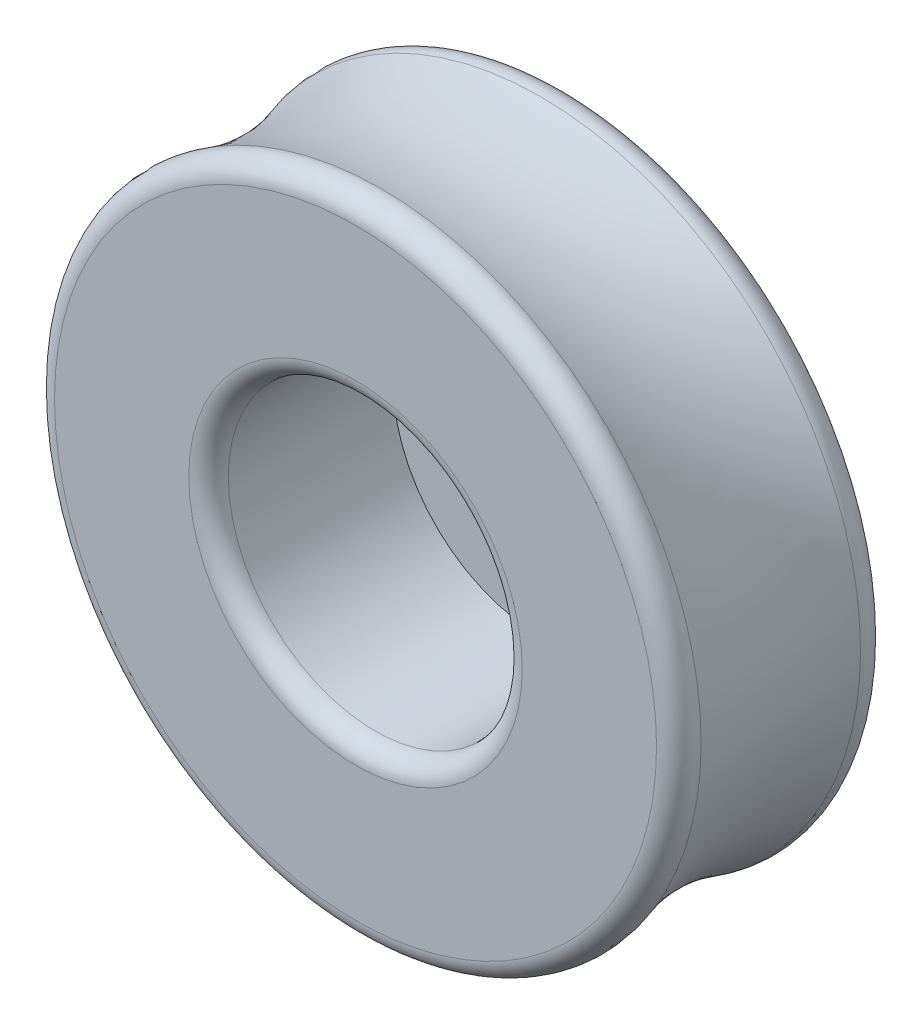
ISO-10303-21;
HEADER;
FILE_DESCRIPTION(('STEP AP214'),'2;1');
FILE_NAME('part.step','',(''),(''),'','','');
FILE_SCHEMA(('AUTOMOTIVE_DESIGN { 1 0 10303 214 1 1 1 1 }'));
ENDSEC;
DATA;
#1=APPLICATION_CONTEXT('core data for automotive mechanical design processes');
#2=APPLICATION_PROTOCOL_DEFINITION('international standard','automotive_design',2000,#1);
#3=PRODUCT_CONTEXT('',#1,'mechanical');
#4=PRODUCT('Part','Part','',(#3));
#5=PRODUCT_RELATED_PRODUCT_CATEGORY('part','',(#4));
#6=PRODUCT_DEFINITION_FORMATION('','',#4);
#7=PRODUCT_DEFINITION_CONTEXT('part definition',#1,'design');
#8=PRODUCT_DEFINITION('design','',#6,#7);
#9=PRODUCT_DEFINITION_SHAPE('','',#8);
#10=(LENGTH_UNIT() NAMED_UNIT(*) SI_UNIT(.MILLI.,.METRE.));
#11=(NAMED_UNIT(*) PLANE_ANGLE_UNIT() SI_UNIT($,.RADIAN.));
#12=(NAMED_UNIT(*) SI_UNIT($,.STERADIAN.) SOLID_ANGLE_UNIT());
#13=UNCERTAINTY_MEASURE_WITH_UNIT(LENGTH_MEASURE(1.E-05),#10,'distance_accuracy_value','');
#14=(GEOMETRIC_REPRESENTATION_CONTEXT(3) GLOBAL_UNCERTAINTY_ASSIGNED_CONTEXT((#13)) GLOBAL_UNIT_ASSIGNED_CONTEXT((#10,
#11,#12)) REPRESENTATION_CONTEXT('',''));
#15=CARTESIAN_POINT('',(0.,0.,0.));
#16=DIRECTION('',(0.,0.,1.));
#17=DIRECTION('',(1.,0.,0.));
#18=AXIS2_PLACEMENT_3D('',#15,#16,#17);
#19=CARTESIAN_POINT('',(0.,0.,-8.));
#20=DIRECTION('',(0.,0.,-1.));
#21=DIRECTION('',(-1.,0.,0.));
#22=AXIS2_PLACEMENT_3D('',#19,#20,#21);
#23=PLANE('',#22);
#24=CARTESIAN_POINT('',(12.5,0.,-8.));
#25=DIRECTION('',(0.,0.,-1.));
#26=DIRECTION('',(-1.,0.,0.));
#27=AXIS2_PLACEMENT_3D('',#24,#25,#26);
#28=CIRCLE('',#27,22.8364012479042);
#29=CARTESIAN_POINT('',(-10.3364012479042,0.,-8.));
#30=VERTEX_POINT('',#29);
#31=EDGE_CURVE('E79',#30,#30,#28,.T.);
#32=ORIENTED_EDGE('',*,*,#31,.T.);
#33=EDGE_LOOP('',(#32));
#34=FACE_BOUND('',#33,.T.);
#35=CARTESIAN_POINT('',(12.5,0.,-8.));
#36=DIRECTION('',(0.,0.,1.));
#37=DIRECTION('',(1.,0.,0.));
#38=AXIS2_PLACEMENT_3D('',#35,#36,#37);
#39=CIRCLE('',#38,6.);
#40=CARTESIAN_POINT('',(18.5,0.,-8.));
#41=VERTEX_POINT('',#40);
#42=EDGE_CURVE('E103',#41,#41,#39,.T.);
#43=ORIENTED_EDGE('',*,*,#42,.T.);
#44=EDGE_LOOP('',(#43));
#45=FACE_BOUND('',#44,.T.);
#46=ADVANCED_FACE('F43',(#34,#45),#23,.T.);
#47=CARTESIAN_POINT('',(12.5,0.,0.));
#48=DIRECTION('',(0.,0.,1.));
#49=DIRECTION('',(1.,0.,0.));
#50=AXIS2_PLACEMENT_3D('',#47,#48,#49);
#51=TOROIDAL_SURFACE('',#50,43.3303027798234,20.);
#52=CARTESIAN_POINT('',(12.5,0.,-6.04651162790698));
#53=DIRECTION('',(0.,0.,1.));
#54=DIRECTION('',(1.,0.,0.));
#55=AXIS2_PLACEMENT_3D('',#52,#53,#54);
#56=CIRCLE('',#55,24.2662083315264);
#57=CARTESIAN_POINT('',(36.7662083315264,0.,-6.04651162790698));
#58=VERTEX_POINT('',#57);
#59=EDGE_CURVE('E83',#58,#58,#56,.T.);
#60=ORIENTED_EDGE('',*,*,#59,.T.);
#61=EDGE_LOOP('',(#60));
#62=FACE_BOUND('',#61,.T.);
#63=CARTESIAN_POINT('',(12.5,0.,6.04651162790698));
#64=DIRECTION('',(0.,0.,-1.));
#65=DIRECTION('',(-1.,0.,0.));
#66=AXIS2_PLACEMENT_3D('',#63,#64,#65);
#67=CIRCLE('',#66,24.2662083315264);
#68=CARTESIAN_POINT('',(-11.7662083315264,0.,6.04651162790698));
#69=VERTEX_POINT('',#68);
#70=EDGE_CURVE('E87',#69,#69,#67,.T.);
#71=ORIENTED_EDGE('',*,*,#70,.T.);
#72=EDGE_LOOP('',(#71));
#73=FACE_BOUND('',#72,.T.);
#74=ADVANCED_FACE('F130',(#62,#73),#51,.F.);
#75=CARTESIAN_POINT('',(0.,0.,8.));
#76=DIRECTION('',(0.,0.,-1.));
#77=DIRECTION('',(-1.,0.,0.));
#78=AXIS2_PLACEMENT_3D('',#75,#76,#77);
#79=PLANE('',#78);
#80=CARTESIAN_POINT('',(12.5,0.,8.));
#81=DIRECTION('',(0.,0.,-1.));
#82=DIRECTION('',(-1.,0.,0.));
#83=AXIS2_PLACEMENT_3D('',#80,#81,#82);
#84=CIRCLE('',#83,22.8364012479042);
#85=CARTESIAN_POINT('',(-10.3364012479042,0.,8.));
#86=VERTEX_POINT('',#85);
#87=EDGE_CURVE('E71',#86,#86,#84,.F.);
#88=ORIENTED_EDGE('',*,*,#87,.T.);
#89=EDGE_LOOP('',(#88));
#90=FACE_BOUND('',#89,.T.);
#91=CARTESIAN_POINT('',(12.5,0.,8.));
#92=DIRECTION('',(0.,0.,-1.));
#93=DIRECTION('',(-1.,0.,0.));
#94=AXIS2_PLACEMENT_3D('',#91,#92,#93);
#95=CIRCLE('',#94,12.65);
#96=CARTESIAN_POINT('',(-0.150000000000003,0.,8.));
#97=VERTEX_POINT('',#96);
#98=EDGE_CURVE('E75',#97,#97,#95,.T.);
#99=ORIENTED_EDGE('',*,*,#98,.T.);
#100=EDGE_LOOP('',(#99));
#101=FACE_BOUND('',#100,.T.);
#102=ADVANCED_FACE('F136',(#90,#101),#79,.F.);
#103=CARTESIAN_POINT('',(0.,0.,-17.));
#104=DIRECTION('',(0.,0.,1.));
#105=DIRECTION('',(1.,0.,0.));
#106=AXIS2_PLACEMENT_3D('',#103,#104,#105);
#107=PLANE('',#106);
#108=CARTESIAN_POINT('',(12.5,0.,-17.));
#109=DIRECTION('',(0.,0.,1.));
#110=DIRECTION('',(1.,0.,0.));
#111=AXIS2_PLACEMENT_3D('',#108,#109,#110);
#112=CIRCLE('',#111,7.);
#113=CARTESIAN_POINT('',(19.5,0.,-17.));
#114=VERTEX_POINT('',#113);
#115=EDGE_CURVE('E10',#114,#114,#112,.F.);
#116=ORIENTED_EDGE('',*,*,#115,.T.);
#117=EDGE_LOOP('',(#116));
#118=FACE_BOUND('',#117,.T.);
#119=CARTESIAN_POINT('',(12.5,0.,-17.));
#120=DIRECTION('',(0.,0.,1.));
#121=DIRECTION('',(1.,0.,0.));
#122=AXIS2_PLACEMENT_3D('',#119,#120,#121);
#123=CIRCLE('',#122,5.75);
#124=CARTESIAN_POINT('',(18.25,0.,-17.));
#125=VERTEX_POINT('',#124);
#126=EDGE_CURVE('E63',#125,#125,#123,.T.);
#127=ORIENTED_EDGE('',*,*,#126,.T.);
#128=EDGE_LOOP('',(#127));
#129=FACE_BOUND('',#128,.T.);
#130=ADVANCED_FACE('F182',(#118,#129),#107,.F.);
#131=CARTESIAN_POINT('',(0.,0.,-15.));
#132=DIRECTION('',(0.,0.,1.));
#133=DIRECTION('',(1.,0.,0.));
#134=AXIS2_PLACEMENT_3D('',#131,#132,#133);
#135=PLANE('',#134);
#136=CARTESIAN_POINT('',(12.5,0.,-15.));
#137=DIRECTION('',(0.,0.,1.));
#138=DIRECTION('',(1.,0.,0.));
#139=AXIS2_PLACEMENT_3D('',#136,#137,#138);
#140=CIRCLE('',#139,7.);
#141=CARTESIAN_POINT('',(19.5,0.,-15.));
#142=VERTEX_POINT('',#141);
#143=EDGE_CURVE('E52',#142,#142,#140,.T.);
#144=ORIENTED_EDGE('',*,*,#143,.T.);
#145=EDGE_LOOP('',(#144));
#146=FACE_BOUND('',#145,.T.);
#147=CARTESIAN_POINT('',(12.5,0.,-15.));
#148=DIRECTION('',(0.,0.,1.));
#149=DIRECTION('',(1.,0.,0.));
#150=AXIS2_PLACEMENT_3D('',#147,#148,#149);
#151=CIRCLE('',#150,6.);
#152=CARTESIAN_POINT('',(18.5,0.,-15.));
#153=VERTEX_POINT('',#152);
#154=EDGE_CURVE('E99',#153,#153,#151,.T.);
#155=ORIENTED_EDGE('',*,*,#154,.F.);
#156=EDGE_LOOP('',(#155));
#157=FACE_BOUND('',#156,.T.);
#158=ADVANCED_FACE('F175',(#146,#157),#135,.T.);
#159=CARTESIAN_POINT('',(12.5,0.,8.));
#160=DIRECTION('',(0.,0.,1.));
#161=DIRECTION('',(1.,0.,0.));
#162=AXIS2_PLACEMENT_3D('',#159,#160,#161);
#163=CYLINDRICAL_SURFACE('',#162,6.);
#164=ORIENTED_EDGE('',*,*,#154,.T.);
#165=EDGE_LOOP('',(#164));
#166=FACE_BOUND('',#165,.T.);
#167=ORIENTED_EDGE('',*,*,#42,.F.);
#168=EDGE_LOOP('',(#167));
#169=FACE_BOUND('',#168,.T.);
#170=ADVANCED_FACE('F167',(#166,#169),#163,.T.);
#171=CARTESIAN_POINT('',(12.5,0.,-6.));
#172=DIRECTION('',(0.,0.,1.));
#173=DIRECTION('',(1.,0.,0.));
#174=AXIS2_PLACEMENT_3D('',#171,#172,#173);
#175=CYLINDRICAL_SURFACE('',#174,11.15);
#176=CARTESIAN_POINT('',(12.5,0.,6.5));
#177=DIRECTION('',(0.,0.,-1.));
#178=DIRECTION('',(-1.,0.,0.));
#179=AXIS2_PLACEMENT_3D('',#176,#177,#178);
#180=CIRCLE('',#179,11.15);
#181=CARTESIAN_POINT('',(1.35,0.,6.5));
#182=VERTEX_POINT('',#181);
#183=EDGE_CURVE('E67',#182,#182,#180,.F.);
#184=ORIENTED_EDGE('',*,*,#183,.T.);
#185=EDGE_LOOP('',(#184));
#186=FACE_BOUND('',#185,.T.);
#187=CARTESIAN_POINT('',(12.5,0.,-6.));
#188=DIRECTION('',(0.,0.,1.));
#189=DIRECTION('',(1.,0.,0.));
#190=AXIS2_PLACEMENT_3D('',#187,#188,#189);
#191=CIRCLE('',#190,11.15);
#192=CARTESIAN_POINT('',(23.65,0.,-6.));
#193=VERTEX_POINT('',#192);
#194=EDGE_CURVE('E107',#193,#193,#191,.T.);
#195=ORIENTED_EDGE('',*,*,#194,.F.);
#196=EDGE_LOOP('',(#195));
#197=FACE_BOUND('',#196,.T.);
#198=ADVANCED_FACE('F163',(#186,#197),#175,.F.);
#199=CARTESIAN_POINT('',(12.5,0.,-6.));
#200=DIRECTION('',(0.,0.,1.));
#201=DIRECTION('',(1.,0.,0.));
#202=AXIS2_PLACEMENT_3D('',#199,#200,#201);
#203=PLANE('',#202);
#204=CARTESIAN_POINT('',(12.5,0.,-6.));
#205=DIRECTION('',(0.,0.,1.));
#206=DIRECTION('',(1.,0.,0.));
#207=AXIS2_PLACEMENT_3D('',#204,#205,#206);
#208=CIRCLE('',#207,5.75);
#209=CARTESIAN_POINT('',(18.25,0.,-6.));
#210=VERTEX_POINT('',#209);
#211=EDGE_CURVE('E91',#210,#210,#208,.F.);
#212=ORIENTED_EDGE('',*,*,#211,.T.);
#213=EDGE_LOOP('',(#212));
#214=FACE_BOUND('',#213,.T.);
#215=ORIENTED_EDGE('',*,*,#194,.T.);
#216=EDGE_LOOP('',(#215));
#217=FACE_BOUND('',#216,.T.);
#218=ADVANCED_FACE('F166',(#214,#217),#203,.T.);
#219=CARTESIAN_POINT('',(12.5,0.,-17.));
#220=DIRECTION('',(0.,0.,1.));
#221=DIRECTION('',(1.,0.,0.));
#222=AXIS2_PLACEMENT_3D('',#219,#220,#221);
#223=CYLINDRICAL_SURFACE('',#222,4.25);
#224=CARTESIAN_POINT('',(12.5,0.,-15.5));
#225=DIRECTION('',(0.,0.,1.));
#226=DIRECTION('',(1.,0.,0.));
#227=AXIS2_PLACEMENT_3D('',#224,#225,#226);
#228=CIRCLE('',#227,4.25);
#229=CARTESIAN_POINT('',(16.75,0.,-15.5));
#230=VERTEX_POINT('',#229);
#231=EDGE_CURVE('E57',#230,#230,#228,.F.);
#232=ORIENTED_EDGE('',*,*,#231,.T.);
#233=EDGE_LOOP('',(#232));
#234=FACE_BOUND('',#233,.T.);
#235=CARTESIAN_POINT('',(12.5,0.,-7.5));
#236=DIRECTION('',(0.,0.,1.));
#237=DIRECTION('',(1.,0.,0.));
#238=AXIS2_PLACEMENT_3D('',#235,#236,#237);
#239=CIRCLE('',#238,4.25);
#240=CARTESIAN_POINT('',(16.75,0.,-7.5));
#241=VERTEX_POINT('',#240);
#242=EDGE_CURVE('E95',#241,#241,#239,.T.);
#243=ORIENTED_EDGE('',*,*,#242,.T.);
#244=EDGE_LOOP('',(#243));
#245=FACE_BOUND('',#244,.T.);
#246=ADVANCED_FACE('F146',(#234,#245),#223,.F.);
#247=CARTESIAN_POINT('',(12.5,0.,-7.5));
#248=DIRECTION('',(0.,0.,1.));
#249=DIRECTION('',(1.,0.,0.));
#250=AXIS2_PLACEMENT_3D('',#247,#248,#249);
#251=TOROIDAL_SURFACE('',#250,5.75,1.5);
#252=ORIENTED_EDGE('',*,*,#211,.F.);
#253=EDGE_LOOP('',(#252));
#254=FACE_BOUND('',#253,.T.);
#255=ORIENTED_EDGE('',*,*,#242,.F.);
#256=EDGE_LOOP('',(#255));
#257=FACE_BOUND('',#256,.T.);
#258=ADVANCED_FACE('F142',(#254,#257),#251,.T.);
#259=CARTESIAN_POINT('',(12.5,0.,-6.5));
#260=DIRECTION('',(0.,0.,1.));
#261=DIRECTION('',(1.,0.,0.));
#262=AXIS2_PLACEMENT_3D('',#259,#260,#261);
#263=TOROIDAL_SURFACE('',#262,22.8364012479042,1.5);
#264=ORIENTED_EDGE('',*,*,#31,.F.);
#265=EDGE_LOOP('',(#264));
#266=FACE_BOUND('',#265,.T.);
#267=ORIENTED_EDGE('',*,*,#59,.F.);
#268=EDGE_LOOP('',(#267));
#269=FACE_BOUND('',#268,.T.);
#270=ADVANCED_FACE('F145',(#266,#269),#263,.T.);
#271=CARTESIAN_POINT('',(12.5,0.,6.5));
#272=DIRECTION('',(0.,0.,1.));
#273=DIRECTION('',(1.,0.,0.));
#274=AXIS2_PLACEMENT_3D('',#271,#272,#273);
#275=TOROIDAL_SURFACE('',#274,22.8364012479042,1.5);
#276=ORIENTED_EDGE('',*,*,#70,.F.);
#277=EDGE_LOOP('',(#276));
#278=FACE_BOUND('',#277,.T.);
#279=ORIENTED_EDGE('',*,*,#87,.F.);
#280=EDGE_LOOP('',(#279));
#281=FACE_BOUND('',#280,.T.);
#282=ADVANCED_FACE('F150',(#278,#281),#275,.T.);
#283=CARTESIAN_POINT('',(12.5,0.,6.5));
#284=DIRECTION('',(0.,0.,-1.));
#285=DIRECTION('',(-1.,0.,0.));
#286=AXIS2_PLACEMENT_3D('',#283,#284,#285);
#287=TOROIDAL_SURFACE('',#286,12.65,1.5);
#288=ORIENTED_EDGE('',*,*,#98,.F.);
#289=EDGE_LOOP('',(#288));
#290=FACE_BOUND('',#289,.T.);
#291=ORIENTED_EDGE('',*,*,#183,.F.);
#292=EDGE_LOOP('',(#291));
#293=FACE_BOUND('',#292,.T.);
#294=ADVANCED_FACE('F126',(#290,#293),#287,.T.);
#295=CARTESIAN_POINT('',(12.5,0.,-15.5));
#296=DIRECTION('',(0.,0.,1.));
#297=DIRECTION('',(1.,0.,0.));
#298=AXIS2_PLACEMENT_3D('',#295,#296,#297);
#299=TOROIDAL_SURFACE('',#298,5.75,1.5);
#300=ORIENTED_EDGE('',*,*,#231,.F.);
#301=EDGE_LOOP('',(#300));
#302=FACE_BOUND('',#301,.T.);
#303=ORIENTED_EDGE('',*,*,#126,.F.);
#304=EDGE_LOOP('',(#303));
#305=FACE_BOUND('',#304,.T.);
#306=ADVANCED_FACE('F120',(#302,#305),#299,.T.);
#307=CARTESIAN_POINT('',(12.5,0.,-16.));
#308=DIRECTION('',(0.,0.,1.));
#309=DIRECTION('',(1.,0.,0.));
#310=AXIS2_PLACEMENT_3D('',#307,#308,#309);
#311=TOROIDAL_SURFACE('',#310,7.,1.);
#312=ORIENTED_EDGE('',*,*,#115,.F.);
#313=EDGE_LOOP('',(#312));
#314=FACE_BOUND('',#313,.T.);
#315=CARTESIAN_POINT('',(12.5,0.,-16.));
#316=DIRECTION('',(0.,0.,1.));
#317=DIRECTION('',(1.,0.,0.));
#318=AXIS2_PLACEMENT_3D('',#315,#316,#317);
#319=CIRCLE('',#318,8.);
#320=CARTESIAN_POINT('',(20.5,0.,-16.));
#321=VERTEX_POINT('',#320);
#322=EDGE_CURVE('E47',#321,#321,#319,.T.);
#323=ORIENTED_EDGE('',*,*,#322,.F.);
#324=EDGE_LOOP('',(#323));
#325=FACE_BOUND('',#324,.T.);
#326=ADVANCED_FACE('F45',(#314,#325),#311,.T.);
#327=CARTESIAN_POINT('',(12.5,0.,-16.));
#328=DIRECTION('',(0.,0.,1.));
#329=DIRECTION('',(1.,0.,0.));
#330=AXIS2_PLACEMENT_3D('',#327,#328,#329);
#331=TOROIDAL_SURFACE('',#330,7.,1.);
#332=ORIENTED_EDGE('',*,*,#322,.T.);
#333=EDGE_LOOP('',(#332));
#334=FACE_BOUND('',#333,.T.);
#335=ORIENTED_EDGE('',*,*,#143,.F.);
#336=EDGE_LOOP('',(#335));
#337=FACE_BOUND('',#336,.T.);
#338=ADVANCED_FACE('F116',(#334,#337),#331,.T.);
#339=CLOSED_SHELL('',(#46,#74,#102,#130,#158,#170,#198,#218,#246,#258,#270,#282,#294,#306,#326,#338));
#340=MANIFOLD_SOLID_BREP('B2',#339);
#341=ADVANCED_BREP_SHAPE_REPRESENTATION('',(#18,#340),#14);
#342=SHAPE_DEFINITION_REPRESENTATION(#9,#341);
ENDSEC;
END-ISO-10303-21;
